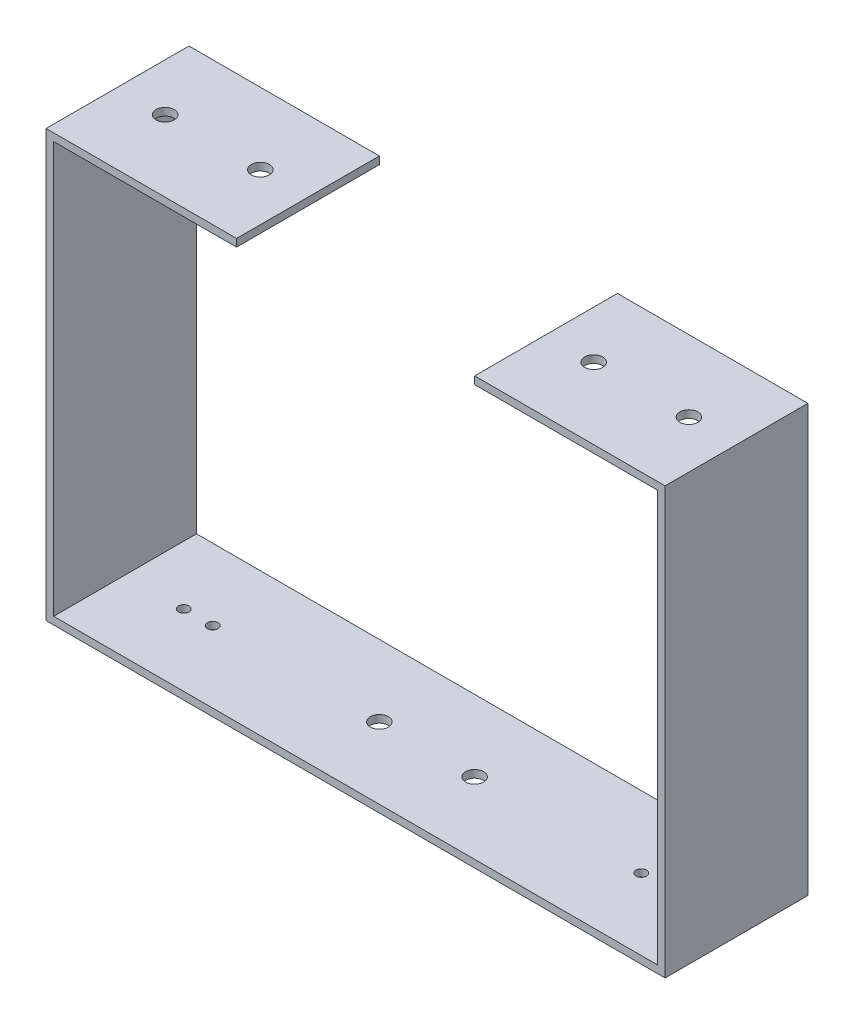
ISO-10303-21;
HEADER;
FILE_DESCRIPTION(('STEP AP214'),'2;1');
FILE_NAME('part.step','',(''),(''),'','','');
FILE_SCHEMA(('AUTOMOTIVE_DESIGN { 1 0 10303 214 1 1 1 1 }'));
ENDSEC;
DATA;
#1=APPLICATION_CONTEXT('core data for automotive mechanical design processes');
#2=APPLICATION_PROTOCOL_DEFINITION('international standard','automotive_design',2000,#1);
#3=PRODUCT_CONTEXT('',#1,'mechanical');
#4=PRODUCT('Part','Part','',(#3));
#5=PRODUCT_RELATED_PRODUCT_CATEGORY('part','',(#4));
#6=PRODUCT_DEFINITION_FORMATION('','',#4);
#7=PRODUCT_DEFINITION_CONTEXT('part definition',#1,'design');
#8=PRODUCT_DEFINITION('design','',#6,#7);
#9=PRODUCT_DEFINITION_SHAPE('','',#8);
#10=(LENGTH_UNIT() NAMED_UNIT(*) SI_UNIT(.MILLI.,.METRE.));
#11=(NAMED_UNIT(*) PLANE_ANGLE_UNIT() SI_UNIT($,.RADIAN.));
#12=(NAMED_UNIT(*) SI_UNIT($,.STERADIAN.) SOLID_ANGLE_UNIT());
#13=UNCERTAINTY_MEASURE_WITH_UNIT(LENGTH_MEASURE(1.E-05),#10,'distance_accuracy_value','');
#14=(GEOMETRIC_REPRESENTATION_CONTEXT(3) GLOBAL_UNCERTAINTY_ASSIGNED_CONTEXT((#13)) GLOBAL_UNIT_ASSIGNED_CONTEXT((#10,
#11,#12)) REPRESENTATION_CONTEXT('',''));
#15=CARTESIAN_POINT('',(0.,0.,0.));
#16=DIRECTION('',(0.,0.,1.));
#17=DIRECTION('',(1.,0.,0.));
#18=AXIS2_PLACEMENT_3D('',#15,#16,#17);
#19=CARTESIAN_POINT('',(0.,0.,-15.));
#20=DIRECTION('',(0.,-1.,0.));
#21=DIRECTION('',(1.,0.,0.));
#22=AXIS2_PLACEMENT_3D('',#19,#20,#21);
#23=PLANE('',#22);
#24=CARTESIAN_POINT('',(-10.,0.,0.));
#25=DIRECTION('',(0.,-1.,0.));
#26=DIRECTION('',(0.,0.,-1.));
#27=AXIS2_PLACEMENT_3D('',#24,#25,#26);
#28=CIRCLE('',#27,1.89864999999999);
#29=CARTESIAN_POINT('',(-10.,0.,-1.89864999999999));
#30=VERTEX_POINT('',#29);
#31=EDGE_CURVE('E386',#30,#30,#28,.T.);
#32=ORIENTED_EDGE('',*,*,#31,.F.);
#33=EDGE_LOOP('',(#32));
#34=FACE_BOUND('',#33,.T.);
#35=CARTESIAN_POINT('',(10.,0.,0.));
#36=DIRECTION('',(0.,-1.,0.));
#37=DIRECTION('',(0.,0.,-1.));
#38=AXIS2_PLACEMENT_3D('',#35,#36,#37);
#39=CIRCLE('',#38,1.89864999999999);
#40=CARTESIAN_POINT('',(10.,0.,-1.89864999999999));
#41=VERTEX_POINT('',#40);
#42=EDGE_CURVE('E388',#41,#41,#39,.T.);
#43=ORIENTED_EDGE('',*,*,#42,.F.);
#44=EDGE_LOOP('',(#43));
#45=FACE_BOUND('',#44,.T.);
#46=CARTESIAN_POINT('',(51.096,0.,0.));
#47=DIRECTION('',(0.,-1.,0.));
#48=DIRECTION('',(0.,0.,-1.));
#49=AXIS2_PLACEMENT_3D('',#46,#47,#48);
#50=CIRCLE('',#49,1.21919999999999);
#51=CARTESIAN_POINT('',(51.096,0.,-1.21919999999999));
#52=VERTEX_POINT('',#51);
#53=EDGE_CURVE('E408',#52,#52,#50,.T.);
#54=ORIENTED_EDGE('',*,*,#53,.F.);
#55=EDGE_LOOP('',(#54));
#56=FACE_BOUND('',#55,.T.);
#57=CARTESIAN_POINT('',(45.,0.,0.));
#58=DIRECTION('',(0.,-1.,0.));
#59=DIRECTION('',(0.,0.,-1.));
#60=AXIS2_PLACEMENT_3D('',#57,#58,#59);
#61=CIRCLE('',#60,1.21919999999999);
#62=CARTESIAN_POINT('',(45.,0.,-1.21919999999999));
#63=VERTEX_POINT('',#62);
#64=EDGE_CURVE('E413',#63,#63,#61,.T.);
#65=ORIENTED_EDGE('',*,*,#64,.F.);
#66=EDGE_LOOP('',(#65));
#67=FACE_BOUND('',#66,.T.);
#68=CARTESIAN_POINT('',(-51.096,0.,0.));
#69=DIRECTION('',(0.,-1.,0.));
#70=DIRECTION('',(0.,0.,-1.));
#71=AXIS2_PLACEMENT_3D('',#68,#69,#70);
#72=CIRCLE('',#71,1.21919999999999);
#73=CARTESIAN_POINT('',(-51.096,0.,-1.21919999999999));
#74=VERTEX_POINT('',#73);
#75=EDGE_CURVE('E194',#74,#74,#72,.T.);
#76=ORIENTED_EDGE('',*,*,#75,.F.);
#77=EDGE_LOOP('',(#76));
#78=FACE_BOUND('',#77,.T.);
#79=CARTESIAN_POINT('',(-45.,0.,0.));
#80=DIRECTION('',(0.,-1.,0.));
#81=DIRECTION('',(0.,0.,-1.));
#82=AXIS2_PLACEMENT_3D('',#79,#80,#81);
#83=CIRCLE('',#82,1.21919999999999);
#84=CARTESIAN_POINT('',(-45.,0.,-1.21919999999999));
#85=VERTEX_POINT('',#84);
#86=EDGE_CURVE('E201',#85,#85,#83,.T.);
#87=ORIENTED_EDGE('',*,*,#86,.F.);
#88=EDGE_LOOP('',(#87));
#89=FACE_BOUND('',#88,.T.);
#90=DIRECTION('',(1.,0.,0.));
#91=VECTOR('',#90,1.);
#92=CARTESIAN_POINT('',(0.,0.,-15.));
#93=LINE('',#92,#91);
#94=CARTESIAN_POINT('',(-65.,0.,-15.));
#95=VERTEX_POINT('',#94);
#96=CARTESIAN_POINT('',(65.,0.,-15.));
#97=VERTEX_POINT('',#96);
#98=EDGE_CURVE('E136',#95,#97,#93,.T.);
#99=ORIENTED_EDGE('',*,*,#98,.T.);
#100=DIRECTION('',(0.,0.,1.));
#101=VECTOR('',#100,1.);
#102=CARTESIAN_POINT('',(65.,0.,-15.));
#103=LINE('',#102,#101);
#104=CARTESIAN_POINT('',(65.,0.,15.));
#105=VERTEX_POINT('',#104);
#106=EDGE_CURVE('E134',#97,#105,#103,.T.);
#107=ORIENTED_EDGE('',*,*,#106,.T.);
#108=DIRECTION('',(1.,0.,0.));
#109=VECTOR('',#108,1.);
#110=CARTESIAN_POINT('',(0.,0.,15.));
#111=LINE('',#110,#109);
#112=CARTESIAN_POINT('',(-65.,0.,15.));
#113=VERTEX_POINT('',#112);
#114=EDGE_CURVE('E122',#113,#105,#111,.T.);
#115=ORIENTED_EDGE('',*,*,#114,.F.);
#116=DIRECTION('',(0.,0.,1.));
#117=VECTOR('',#116,1.);
#118=CARTESIAN_POINT('',(-65.,0.,-15.));
#119=LINE('',#118,#117);
#120=EDGE_CURVE('E11',#95,#113,#119,.T.);
#121=ORIENTED_EDGE('',*,*,#120,.F.);
#122=EDGE_LOOP('',(#99,#107,#115,#121));
#123=FACE_BOUND('',#122,.T.);
#124=ADVANCED_FACE('F34',(#34,#45,#56,#67,#78,#89,#123),#23,.T.);
#125=CARTESIAN_POINT('',(-65.,0.,-15.));
#126=DIRECTION('',(-1.,0.,0.));
#127=DIRECTION('',(0.,0.,1.));
#128=AXIS2_PLACEMENT_3D('',#125,#126,#127);
#129=PLANE('',#128);
#130=ORIENTED_EDGE('',*,*,#120,.T.);
#131=DIRECTION('',(0.,-1.,0.));
#132=VECTOR('',#131,1.);
#133=CARTESIAN_POINT('',(-65.,0.,15.));
#134=LINE('',#133,#132);
#135=CARTESIAN_POINT('',(-65.,89.52,15.));
#136=VERTEX_POINT('',#135);
#137=EDGE_CURVE('E130',#136,#113,#134,.T.);
#138=ORIENTED_EDGE('',*,*,#137,.F.);
#139=DIRECTION('',(0.,0.,1.));
#140=VECTOR('',#139,1.);
#141=CARTESIAN_POINT('',(-65.,89.52,-15.));
#142=LINE('',#141,#140);
#143=CARTESIAN_POINT('',(-65.,89.52,-15.));
#144=VERTEX_POINT('',#143);
#145=EDGE_CURVE('E43',#144,#136,#142,.T.);
#146=ORIENTED_EDGE('',*,*,#145,.F.);
#147=DIRECTION('',(0.,-1.,0.));
#148=VECTOR('',#147,1.);
#149=CARTESIAN_POINT('',(-65.,0.,-15.));
#150=LINE('',#149,#148);
#151=EDGE_CURVE('E237',#144,#95,#150,.T.);
#152=ORIENTED_EDGE('',*,*,#151,.T.);
#153=EDGE_LOOP('',(#130,#138,#146,#152));
#154=FACE_BOUND('',#153,.T.);
#155=ADVANCED_FACE('F284',(#154),#129,.T.);
#156=CARTESIAN_POINT('',(-65.,89.52,-15.));
#157=DIRECTION('',(0.,1.,0.));
#158=DIRECTION('',(0.,0.,1.));
#159=AXIS2_PLACEMENT_3D('',#156,#157,#158);
#160=PLANE('',#159);
#161=CARTESIAN_POINT('',(-35.,89.52,0.));
#162=DIRECTION('',(0.,1.,0.));
#163=DIRECTION('',(0.,0.,1.));
#164=AXIS2_PLACEMENT_3D('',#161,#162,#163);
#165=CIRCLE('',#164,1.89865);
#166=CARTESIAN_POINT('',(-35.,89.52,1.89865000000001));
#167=VERTEX_POINT('',#166);
#168=EDGE_CURVE('E175',#167,#167,#165,.T.);
#169=ORIENTED_EDGE('',*,*,#168,.F.);
#170=EDGE_LOOP('',(#169));
#171=FACE_BOUND('',#170,.T.);
#172=CARTESIAN_POINT('',(-55.,89.52,0.));
#173=DIRECTION('',(0.,1.,0.));
#174=DIRECTION('',(0.,0.,1.));
#175=AXIS2_PLACEMENT_3D('',#172,#173,#174);
#176=CIRCLE('',#175,1.89865);
#177=CARTESIAN_POINT('',(-55.,89.52,1.89865000000001));
#178=VERTEX_POINT('',#177);
#179=EDGE_CURVE('E188',#178,#178,#176,.T.);
#180=ORIENTED_EDGE('',*,*,#179,.F.);
#181=EDGE_LOOP('',(#180));
#182=FACE_BOUND('',#181,.T.);
#183=ORIENTED_EDGE('',*,*,#145,.T.);
#184=DIRECTION('',(-1.,0.,0.));
#185=VECTOR('',#184,1.);
#186=CARTESIAN_POINT('',(-65.,89.52,15.));
#187=LINE('',#186,#185);
#188=CARTESIAN_POINT('',(-25.,89.52,15.));
#189=VERTEX_POINT('',#188);
#190=EDGE_CURVE('E220',#189,#136,#187,.T.);
#191=ORIENTED_EDGE('',*,*,#190,.F.);
#192=DIRECTION('',(0.,0.,1.));
#193=VECTOR('',#192,1.);
#194=CARTESIAN_POINT('',(-25.,89.52,-15.));
#195=LINE('',#194,#193);
#196=CARTESIAN_POINT('',(-25.,89.52,-15.));
#197=VERTEX_POINT('',#196);
#198=EDGE_CURVE('E242',#197,#189,#195,.T.);
#199=ORIENTED_EDGE('',*,*,#198,.F.);
#200=DIRECTION('',(-1.,0.,0.));
#201=VECTOR('',#200,1.);
#202=CARTESIAN_POINT('',(-65.,89.52,-15.));
#203=LINE('',#202,#201);
#204=EDGE_CURVE('E234',#197,#144,#203,.T.);
#205=ORIENTED_EDGE('',*,*,#204,.T.);
#206=EDGE_LOOP('',(#183,#191,#199,#205));
#207=FACE_BOUND('',#206,.T.);
#208=ADVANCED_FACE('F282',(#171,#182,#207),#160,.T.);
#209=CARTESIAN_POINT('',(-25.,89.52,-15.));
#210=DIRECTION('',(1.,0.,0.));
#211=DIRECTION('',(0.,0.,-1.));
#212=AXIS2_PLACEMENT_3D('',#209,#210,#211);
#213=PLANE('',#212);
#214=ORIENTED_EDGE('',*,*,#198,.T.);
#215=DIRECTION('',(0.,1.,0.));
#216=VECTOR('',#215,1.);
#217=CARTESIAN_POINT('',(-25.,89.52,15.));
#218=LINE('',#217,#216);
#219=CARTESIAN_POINT('',(-25.,87.9325,15.));
#220=VERTEX_POINT('',#219);
#221=EDGE_CURVE('E217',#220,#189,#218,.T.);
#222=ORIENTED_EDGE('',*,*,#221,.F.);
#223=DIRECTION('',(0.,0.,1.));
#224=VECTOR('',#223,1.);
#225=CARTESIAN_POINT('',(-25.,87.9325,-15.));
#226=LINE('',#225,#224);
#227=CARTESIAN_POINT('',(-25.,87.9325,-15.));
#228=VERTEX_POINT('',#227);
#229=EDGE_CURVE('E244',#228,#220,#226,.T.);
#230=ORIENTED_EDGE('',*,*,#229,.F.);
#231=DIRECTION('',(0.,1.,0.));
#232=VECTOR('',#231,1.);
#233=CARTESIAN_POINT('',(-25.,89.52,-15.));
#234=LINE('',#233,#232);
#235=EDGE_CURVE('E231',#228,#197,#234,.T.);
#236=ORIENTED_EDGE('',*,*,#235,.T.);
#237=EDGE_LOOP('',(#214,#222,#230,#236));
#238=FACE_BOUND('',#237,.T.);
#239=ADVANCED_FACE('F278',(#238),#213,.T.);
#240=CARTESIAN_POINT('',(-63.4125,87.9325,-15.));
#241=DIRECTION('',(0.,-1.,0.));
#242=DIRECTION('',(0.,0.,-1.));
#243=AXIS2_PLACEMENT_3D('',#240,#241,#242);
#244=PLANE('',#243);
#245=CARTESIAN_POINT('',(-35.,87.9325,0.));
#246=DIRECTION('',(0.,-1.,0.));
#247=DIRECTION('',(0.,0.,-1.));
#248=AXIS2_PLACEMENT_3D('',#245,#246,#247);
#249=CIRCLE('',#248,1.89865);
#250=CARTESIAN_POINT('',(-35.,87.9325,-1.89865));
#251=VERTEX_POINT('',#250);
#252=EDGE_CURVE('E185',#251,#251,#249,.F.);
#253=ORIENTED_EDGE('',*,*,#252,.T.);
#254=EDGE_LOOP('',(#253));
#255=FACE_BOUND('',#254,.T.);
#256=CARTESIAN_POINT('',(-55.,87.9325,0.));
#257=DIRECTION('',(0.,-1.,0.));
#258=DIRECTION('',(0.,0.,-1.));
#259=AXIS2_PLACEMENT_3D('',#256,#257,#258);
#260=CIRCLE('',#259,1.89865);
#261=CARTESIAN_POINT('',(-55.,87.9325,-1.89864999999999));
#262=VERTEX_POINT('',#261);
#263=EDGE_CURVE('E191',#262,#262,#260,.F.);
#264=ORIENTED_EDGE('',*,*,#263,.T.);
#265=EDGE_LOOP('',(#264));
#266=FACE_BOUND('',#265,.T.);
#267=ORIENTED_EDGE('',*,*,#229,.T.);
#268=DIRECTION('',(1.,0.,0.));
#269=VECTOR('',#268,1.);
#270=CARTESIAN_POINT('',(-63.4125,87.9325,15.));
#271=LINE('',#270,#269);
#272=CARTESIAN_POINT('',(-63.4125,87.9325,15.));
#273=VERTEX_POINT('',#272);
#274=EDGE_CURVE('E214',#273,#220,#271,.T.);
#275=ORIENTED_EDGE('',*,*,#274,.F.);
#276=DIRECTION('',(0.,0.,1.));
#277=VECTOR('',#276,1.);
#278=CARTESIAN_POINT('',(-63.4125,87.9325,-15.));
#279=LINE('',#278,#277);
#280=CARTESIAN_POINT('',(-63.4125,87.9325,-15.));
#281=VERTEX_POINT('',#280);
#282=EDGE_CURVE('E246',#281,#273,#279,.T.);
#283=ORIENTED_EDGE('',*,*,#282,.F.);
#284=DIRECTION('',(1.,0.,0.));
#285=VECTOR('',#284,1.);
#286=CARTESIAN_POINT('',(-63.4125,87.9325,-15.));
#287=LINE('',#286,#285);
#288=EDGE_CURVE('E228',#281,#228,#287,.T.);
#289=ORIENTED_EDGE('',*,*,#288,.T.);
#290=EDGE_LOOP('',(#267,#275,#283,#289));
#291=FACE_BOUND('',#290,.T.);
#292=ADVANCED_FACE('F273',(#255,#266,#291),#244,.T.);
#293=CARTESIAN_POINT('',(-63.4125,1.58749999999999,-15.));
#294=DIRECTION('',(1.,0.,0.));
#295=DIRECTION('',(0.,0.,-1.));
#296=AXIS2_PLACEMENT_3D('',#293,#294,#295);
#297=PLANE('',#296);
#298=ORIENTED_EDGE('',*,*,#282,.T.);
#299=DIRECTION('',(0.,1.,0.));
#300=VECTOR('',#299,1.);
#301=CARTESIAN_POINT('',(-63.4125,1.58749999999999,15.));
#302=LINE('',#301,#300);
#303=CARTESIAN_POINT('',(-63.4125,1.58749999999999,15.));
#304=VERTEX_POINT('',#303);
#305=EDGE_CURVE('E211',#304,#273,#302,.T.);
#306=ORIENTED_EDGE('',*,*,#305,.F.);
#307=DIRECTION('',(0.,0.,1.));
#308=VECTOR('',#307,1.);
#309=CARTESIAN_POINT('',(-63.4125,1.58749999999999,-15.));
#310=LINE('',#309,#308);
#311=CARTESIAN_POINT('',(-63.4125,1.58749999999999,-15.));
#312=VERTEX_POINT('',#311);
#313=EDGE_CURVE('E239',#312,#304,#310,.T.);
#314=ORIENTED_EDGE('',*,*,#313,.F.);
#315=DIRECTION('',(0.,1.,0.));
#316=VECTOR('',#315,1.);
#317=CARTESIAN_POINT('',(-63.4125,1.58749999999999,-15.));
#318=LINE('',#317,#316);
#319=EDGE_CURVE('E225',#312,#281,#318,.T.);
#320=ORIENTED_EDGE('',*,*,#319,.T.);
#321=EDGE_LOOP('',(#298,#306,#314,#320));
#322=FACE_BOUND('',#321,.T.);
#323=ADVANCED_FACE('F260',(#322),#297,.T.);
#324=CARTESIAN_POINT('',(0.,1.5875,-15.));
#325=DIRECTION('',(0.,1.,0.));
#326=DIRECTION('',(-1.,0.,0.));
#327=AXIS2_PLACEMENT_3D('',#324,#325,#326);
#328=PLANE('',#327);
#329=CARTESIAN_POINT('',(-10.,1.5875,0.));
#330=DIRECTION('',(0.,1.,0.));
#331=DIRECTION('',(-1.,0.,0.));
#332=AXIS2_PLACEMENT_3D('',#329,#330,#331);
#333=CIRCLE('',#332,1.89864999999999);
#334=CARTESIAN_POINT('',(-11.89865,1.5875,0.));
#335=VERTEX_POINT('',#334);
#336=EDGE_CURVE('E384',#335,#335,#333,.T.);
#337=ORIENTED_EDGE('',*,*,#336,.F.);
#338=EDGE_LOOP('',(#337));
#339=FACE_BOUND('',#338,.T.);
#340=CARTESIAN_POINT('',(10.,1.5875,0.));
#341=DIRECTION('',(0.,1.,0.));
#342=DIRECTION('',(-1.,0.,0.));
#343=AXIS2_PLACEMENT_3D('',#340,#341,#342);
#344=CIRCLE('',#343,1.89864999999999);
#345=CARTESIAN_POINT('',(8.10135000000001,1.5875,0.));
#346=VERTEX_POINT('',#345);
#347=EDGE_CURVE('E393',#346,#346,#344,.T.);
#348=ORIENTED_EDGE('',*,*,#347,.F.);
#349=EDGE_LOOP('',(#348));
#350=FACE_BOUND('',#349,.T.);
#351=CARTESIAN_POINT('',(51.096,1.58750000000001,0.));
#352=DIRECTION('',(0.,1.,0.));
#353=DIRECTION('',(-1.,0.,0.));
#354=AXIS2_PLACEMENT_3D('',#351,#352,#353);
#355=CIRCLE('',#354,1.10686113494132);
#356=CARTESIAN_POINT('',(49.9891388650587,1.58750000000001,0.));
#357=VERTEX_POINT('',#356);
#358=EDGE_CURVE('E38',#357,#357,#355,.T.);
#359=ORIENTED_EDGE('',*,*,#358,.F.);
#360=EDGE_LOOP('',(#359));
#361=FACE_BOUND('',#360,.T.);
#362=CARTESIAN_POINT('',(45.,1.58750000000001,0.));
#363=DIRECTION('',(0.,1.,0.));
#364=DIRECTION('',(-1.,0.,0.));
#365=AXIS2_PLACEMENT_3D('',#362,#363,#364);
#366=CIRCLE('',#365,1.10686113494132);
#367=CARTESIAN_POINT('',(43.8931388650587,1.58750000000001,0.));
#368=VERTEX_POINT('',#367);
#369=EDGE_CURVE('E146',#368,#368,#366,.T.);
#370=ORIENTED_EDGE('',*,*,#369,.F.);
#371=EDGE_LOOP('',(#370));
#372=FACE_BOUND('',#371,.T.);
#373=CARTESIAN_POINT('',(-51.096,1.58749999999999,0.));
#374=DIRECTION('',(0.,1.,0.));
#375=DIRECTION('',(-1.,0.,0.));
#376=AXIS2_PLACEMENT_3D('',#373,#374,#375);
#377=CIRCLE('',#376,1.10686113494134);
#378=CARTESIAN_POINT('',(-52.2028611349413,1.58749999999999,0.));
#379=VERTEX_POINT('',#378);
#380=EDGE_CURVE('E200',#379,#379,#377,.T.);
#381=ORIENTED_EDGE('',*,*,#380,.F.);
#382=EDGE_LOOP('',(#381));
#383=FACE_BOUND('',#382,.T.);
#384=CARTESIAN_POINT('',(-45.,1.58749999999999,0.));
#385=DIRECTION('',(0.,1.,0.));
#386=DIRECTION('',(-1.,0.,0.));
#387=AXIS2_PLACEMENT_3D('',#384,#385,#386);
#388=CIRCLE('',#387,1.10686113494134);
#389=CARTESIAN_POINT('',(-46.1068611349413,1.58749999999999,0.));
#390=VERTEX_POINT('',#389);
#391=EDGE_CURVE('E207',#390,#390,#388,.T.);
#392=ORIENTED_EDGE('',*,*,#391,.F.);
#393=EDGE_LOOP('',(#392));
#394=FACE_BOUND('',#393,.T.);
#395=ORIENTED_EDGE('',*,*,#313,.T.);
#396=DIRECTION('',(-1.,0.,0.));
#397=VECTOR('',#396,1.);
#398=CARTESIAN_POINT('',(0.,1.5875,15.));
#399=LINE('',#398,#397);
#400=CARTESIAN_POINT('',(63.4125,1.58749999999999,15.));
#401=VERTEX_POINT('',#400);
#402=EDGE_CURVE('E208',#401,#304,#399,.T.);
#403=ORIENTED_EDGE('',*,*,#402,.F.);
#404=DIRECTION('',(0.,0.,1.));
#405=VECTOR('',#404,1.);
#406=CARTESIAN_POINT('',(63.4125,1.58749999999999,-15.));
#407=LINE('',#406,#405);
#408=CARTESIAN_POINT('',(63.4125,1.58749999999999,-15.));
#409=VERTEX_POINT('',#408);
#410=EDGE_CURVE('E172',#409,#401,#407,.T.);
#411=ORIENTED_EDGE('',*,*,#410,.F.);
#412=DIRECTION('',(-1.,0.,0.));
#413=VECTOR('',#412,1.);
#414=CARTESIAN_POINT('',(0.,1.5875,-15.));
#415=LINE('',#414,#413);
#416=EDGE_CURVE('E131',#409,#312,#415,.T.);
#417=ORIENTED_EDGE('',*,*,#416,.T.);
#418=EDGE_LOOP('',(#395,#403,#411,#417));
#419=FACE_BOUND('',#418,.T.);
#420=ADVANCED_FACE('F36',(#339,#350,#361,#372,#383,#394,#419),#328,.T.);
#421=CARTESIAN_POINT('',(0.,0.,-15.));
#422=DIRECTION('',(0.,0.,-1.));
#423=DIRECTION('',(-1.,0.,0.));
#424=AXIS2_PLACEMENT_3D('',#421,#422,#423);
#425=PLANE('',#424);
#426=ORIENTED_EDGE('',*,*,#416,.F.);
#427=DIRECTION('',(0.,1.,0.));
#428=VECTOR('',#427,1.);
#429=CARTESIAN_POINT('',(63.4125,1.58749999999999,-15.));
#430=LINE('',#429,#428);
#431=CARTESIAN_POINT('',(63.4125,87.9325,-15.));
#432=VERTEX_POINT('',#431);
#433=EDGE_CURVE('E141',#409,#432,#430,.T.);
#434=ORIENTED_EDGE('',*,*,#433,.T.);
#435=DIRECTION('',(-1.,0.,0.));
#436=VECTOR('',#435,1.);
#437=CARTESIAN_POINT('',(63.4125,87.9325,-15.));
#438=LINE('',#437,#436);
#439=CARTESIAN_POINT('',(25.,87.9325,-15.));
#440=VERTEX_POINT('',#439);
#441=EDGE_CURVE('E169',#432,#440,#438,.T.);
#442=ORIENTED_EDGE('',*,*,#441,.T.);
#443=DIRECTION('',(0.,1.,0.));
#444=VECTOR('',#443,1.);
#445=CARTESIAN_POINT('',(25.,89.52,-15.));
#446=LINE('',#445,#444);
#447=CARTESIAN_POINT('',(25.,89.52,-15.));
#448=VERTEX_POINT('',#447);
#449=EDGE_CURVE('E167',#440,#448,#446,.T.);
#450=ORIENTED_EDGE('',*,*,#449,.T.);
#451=DIRECTION('',(1.,0.,0.));
#452=VECTOR('',#451,1.);
#453=CARTESIAN_POINT('',(65.,89.52,-15.));
#454=LINE('',#453,#452);
#455=CARTESIAN_POINT('',(65.,89.52,-15.));
#456=VERTEX_POINT('',#455);
#457=EDGE_CURVE('E165',#448,#456,#454,.T.);
#458=ORIENTED_EDGE('',*,*,#457,.T.);
#459=DIRECTION('',(0.,-1.,0.));
#460=VECTOR('',#459,1.);
#461=CARTESIAN_POINT('',(65.,0.,-15.));
#462=LINE('',#461,#460);
#463=EDGE_CURVE('E163',#456,#97,#462,.T.);
#464=ORIENTED_EDGE('',*,*,#463,.T.);
#465=ORIENTED_EDGE('',*,*,#98,.F.);
#466=ORIENTED_EDGE('',*,*,#151,.F.);
#467=ORIENTED_EDGE('',*,*,#204,.F.);
#468=ORIENTED_EDGE('',*,*,#235,.F.);
#469=ORIENTED_EDGE('',*,*,#288,.F.);
#470=ORIENTED_EDGE('',*,*,#319,.F.);
#471=EDGE_LOOP('',(#426,#434,#442,#450,#458,#464,#465,#466,#467,#468,#469,#470));
#472=FACE_BOUND('',#471,.T.);
#473=ADVANCED_FACE('F259',(#472),#425,.T.);
#474=CARTESIAN_POINT('',(0.,0.,15.));
#475=DIRECTION('',(0.,0.,-1.));
#476=DIRECTION('',(-1.,0.,0.));
#477=AXIS2_PLACEMENT_3D('',#474,#475,#476);
#478=PLANE('',#477);
#479=ORIENTED_EDGE('',*,*,#114,.T.);
#480=DIRECTION('',(0.,-1.,0.));
#481=VECTOR('',#480,1.);
#482=CARTESIAN_POINT('',(65.,0.,15.));
#483=LINE('',#482,#481);
#484=CARTESIAN_POINT('',(65.,89.52,15.));
#485=VERTEX_POINT('',#484);
#486=EDGE_CURVE('E127',#485,#105,#483,.T.);
#487=ORIENTED_EDGE('',*,*,#486,.F.);
#488=DIRECTION('',(1.,0.,0.));
#489=VECTOR('',#488,1.);
#490=CARTESIAN_POINT('',(65.,89.52,15.));
#491=LINE('',#490,#489);
#492=CARTESIAN_POINT('',(25.,89.52,15.));
#493=VERTEX_POINT('',#492);
#494=EDGE_CURVE('E145',#493,#485,#491,.T.);
#495=ORIENTED_EDGE('',*,*,#494,.F.);
#496=DIRECTION('',(0.,1.,0.));
#497=VECTOR('',#496,1.);
#498=CARTESIAN_POINT('',(25.,89.52,15.));
#499=LINE('',#498,#497);
#500=CARTESIAN_POINT('',(25.,87.9325,15.));
#501=VERTEX_POINT('',#500);
#502=EDGE_CURVE('E148',#501,#493,#499,.T.);
#503=ORIENTED_EDGE('',*,*,#502,.F.);
#504=DIRECTION('',(-1.,0.,0.));
#505=VECTOR('',#504,1.);
#506=CARTESIAN_POINT('',(63.4125,87.9325,15.));
#507=LINE('',#506,#505);
#508=CARTESIAN_POINT('',(63.4125,87.9325,15.));
#509=VERTEX_POINT('',#508);
#510=EDGE_CURVE('E157',#509,#501,#507,.T.);
#511=ORIENTED_EDGE('',*,*,#510,.F.);
#512=DIRECTION('',(0.,1.,0.));
#513=VECTOR('',#512,1.);
#514=CARTESIAN_POINT('',(63.4125,1.58749999999999,15.));
#515=LINE('',#514,#513);
#516=EDGE_CURVE('E160',#401,#509,#515,.T.);
#517=ORIENTED_EDGE('',*,*,#516,.F.);
#518=ORIENTED_EDGE('',*,*,#402,.T.);
#519=ORIENTED_EDGE('',*,*,#305,.T.);
#520=ORIENTED_EDGE('',*,*,#274,.T.);
#521=ORIENTED_EDGE('',*,*,#221,.T.);
#522=ORIENTED_EDGE('',*,*,#190,.T.);
#523=ORIENTED_EDGE('',*,*,#137,.T.);
#524=EDGE_LOOP('',(#479,#487,#495,#503,#511,#517,#518,#519,#520,#521,#522,#523));
#525=FACE_BOUND('',#524,.T.);
#526=ADVANCED_FACE('F124',(#525),#478,.F.);
#527=CARTESIAN_POINT('',(-45.,1.51999999999999,0.));
#528=DIRECTION('',(0.,-1.,0.));
#529=DIRECTION('',(0.,0.,-1.));
#530=AXIS2_PLACEMENT_3D('',#527,#528,#529);
#531=CONICAL_SURFACE('',#530,1.2192,1.02974425867665);
#532=ORIENTED_EDGE('',*,*,#391,.T.);
#533=EDGE_LOOP('',(#532));
#534=FACE_BOUND('',#533,.T.);
#535=CARTESIAN_POINT('',(-45.,1.51999999999999,0.));
#536=DIRECTION('',(0.,-1.,0.));
#537=DIRECTION('',(0.,0.,-1.));
#538=AXIS2_PLACEMENT_3D('',#535,#536,#537);
#539=CIRCLE('',#538,1.2192);
#540=CARTESIAN_POINT('',(-45.,1.51999999999999,-1.2192));
#541=VERTEX_POINT('',#540);
#542=EDGE_CURVE('E204',#541,#541,#539,.T.);
#543=ORIENTED_EDGE('',*,*,#542,.T.);
#544=EDGE_LOOP('',(#543));
#545=FACE_BOUND('',#544,.T.);
#546=ADVANCED_FACE('F308',(#534,#545),#531,.F.);
#547=CARTESIAN_POINT('',(-45.,0.,0.));
#548=DIRECTION('',(0.,-1.,0.));
#549=DIRECTION('',(0.,0.,-1.));
#550=AXIS2_PLACEMENT_3D('',#547,#548,#549);
#551=CYLINDRICAL_SURFACE('',#550,1.21919999999999);
#552=ORIENTED_EDGE('',*,*,#542,.F.);
#553=EDGE_LOOP('',(#552));
#554=FACE_BOUND('',#553,.T.);
#555=ORIENTED_EDGE('',*,*,#86,.T.);
#556=EDGE_LOOP('',(#555));
#557=FACE_BOUND('',#556,.T.);
#558=ADVANCED_FACE('F311',(#554,#557),#551,.F.);
#559=CARTESIAN_POINT('',(-51.096,1.51999999999999,0.));
#560=DIRECTION('',(0.,-1.,0.));
#561=DIRECTION('',(0.,0.,-1.));
#562=AXIS2_PLACEMENT_3D('',#559,#560,#561);
#563=CONICAL_SURFACE('',#562,1.2192,1.02974425867665);
#564=ORIENTED_EDGE('',*,*,#380,.T.);
#565=EDGE_LOOP('',(#564));
#566=FACE_BOUND('',#565,.T.);
#567=CARTESIAN_POINT('',(-51.096,1.51999999999999,0.));
#568=DIRECTION('',(0.,-1.,0.));
#569=DIRECTION('',(0.,0.,-1.));
#570=AXIS2_PLACEMENT_3D('',#567,#568,#569);
#571=CIRCLE('',#570,1.2192);
#572=CARTESIAN_POINT('',(-51.096,1.51999999999999,-1.2192));
#573=VERTEX_POINT('',#572);
#574=EDGE_CURVE('E197',#573,#573,#571,.T.);
#575=ORIENTED_EDGE('',*,*,#574,.T.);
#576=EDGE_LOOP('',(#575));
#577=FACE_BOUND('',#576,.T.);
#578=ADVANCED_FACE('F254',(#566,#577),#563,.F.);
#579=CARTESIAN_POINT('',(-51.096,0.,0.));
#580=DIRECTION('',(0.,-1.,0.));
#581=DIRECTION('',(0.,0.,-1.));
#582=AXIS2_PLACEMENT_3D('',#579,#580,#581);
#583=CYLINDRICAL_SURFACE('',#582,1.21919999999999);
#584=ORIENTED_EDGE('',*,*,#574,.F.);
#585=EDGE_LOOP('',(#584));
#586=FACE_BOUND('',#585,.T.);
#587=ORIENTED_EDGE('',*,*,#75,.T.);
#588=EDGE_LOOP('',(#587));
#589=FACE_BOUND('',#588,.T.);
#590=ADVANCED_FACE('F318',(#586,#589),#583,.F.);
#591=CARTESIAN_POINT('',(-55.,89.52,0.));
#592=DIRECTION('',(0.,1.,0.));
#593=DIRECTION('',(0.,0.,1.));
#594=AXIS2_PLACEMENT_3D('',#591,#592,#593);
#595=CYLINDRICAL_SURFACE('',#594,1.89865);
#596=ORIENTED_EDGE('',*,*,#263,.F.);
#597=EDGE_LOOP('',(#596));
#598=FACE_BOUND('',#597,.T.);
#599=ORIENTED_EDGE('',*,*,#179,.T.);
#600=EDGE_LOOP('',(#599));
#601=FACE_BOUND('',#600,.T.);
#602=ADVANCED_FACE('F321',(#598,#601),#595,.F.);
#603=CARTESIAN_POINT('',(-35.,89.52,0.));
#604=DIRECTION('',(0.,1.,0.));
#605=DIRECTION('',(0.,0.,1.));
#606=AXIS2_PLACEMENT_3D('',#603,#604,#605);
#607=CYLINDRICAL_SURFACE('',#606,1.89865);
#608=ORIENTED_EDGE('',*,*,#252,.F.);
#609=EDGE_LOOP('',(#608));
#610=FACE_BOUND('',#609,.T.);
#611=ORIENTED_EDGE('',*,*,#168,.T.);
#612=EDGE_LOOP('',(#611));
#613=FACE_BOUND('',#612,.T.);
#614=ADVANCED_FACE('F325',(#610,#613),#607,.F.);
#615=CARTESIAN_POINT('',(63.4125,1.58749999999999,-15.));
#616=DIRECTION('',(1.,0.,0.));
#617=DIRECTION('',(0.,0.,-1.));
#618=AXIS2_PLACEMENT_3D('',#615,#616,#617);
#619=PLANE('',#618);
#620=ORIENTED_EDGE('',*,*,#410,.T.);
#621=ORIENTED_EDGE('',*,*,#516,.T.);
#622=DIRECTION('',(0.,0.,1.));
#623=VECTOR('',#622,1.);
#624=CARTESIAN_POINT('',(63.4125,87.9325,-15.));
#625=LINE('',#624,#623);
#626=EDGE_CURVE('E176',#432,#509,#625,.T.);
#627=ORIENTED_EDGE('',*,*,#626,.F.);
#628=ORIENTED_EDGE('',*,*,#433,.F.);
#629=EDGE_LOOP('',(#620,#621,#627,#628));
#630=FACE_BOUND('',#629,.T.);
#631=ADVANCED_FACE('F329',(#630),#619,.F.);
#632=CARTESIAN_POINT('',(63.4125,87.9325,-15.));
#633=DIRECTION('',(0.,1.,0.));
#634=DIRECTION('',(0.,0.,1.));
#635=AXIS2_PLACEMENT_3D('',#632,#633,#634);
#636=PLANE('',#635);
#637=CARTESIAN_POINT('',(35.,87.9325,0.));
#638=DIRECTION('',(0.,1.,0.));
#639=DIRECTION('',(0.,0.,1.));
#640=AXIS2_PLACEMENT_3D('',#637,#638,#639);
#641=CIRCLE('',#640,1.89865);
#642=CARTESIAN_POINT('',(35.,87.9325,1.89865000000001));
#643=VERTEX_POINT('',#642);
#644=EDGE_CURVE('E399',#643,#643,#641,.T.);
#645=ORIENTED_EDGE('',*,*,#644,.T.);
#646=EDGE_LOOP('',(#645));
#647=FACE_BOUND('',#646,.T.);
#648=CARTESIAN_POINT('',(55.,87.9325,0.));
#649=DIRECTION('',(0.,1.,0.));
#650=DIRECTION('',(0.,0.,1.));
#651=AXIS2_PLACEMENT_3D('',#648,#649,#650);
#652=CIRCLE('',#651,1.89865);
#653=CARTESIAN_POINT('',(55.,87.9325,1.89865000000001));
#654=VERTEX_POINT('',#653);
#655=EDGE_CURVE('E405',#654,#654,#652,.T.);
#656=ORIENTED_EDGE('',*,*,#655,.T.);
#657=EDGE_LOOP('',(#656));
#658=FACE_BOUND('',#657,.T.);
#659=ORIENTED_EDGE('',*,*,#626,.T.);
#660=ORIENTED_EDGE('',*,*,#510,.T.);
#661=DIRECTION('',(0.,0.,1.));
#662=VECTOR('',#661,1.);
#663=CARTESIAN_POINT('',(25.,87.9325,-15.));
#664=LINE('',#663,#662);
#665=EDGE_CURVE('E178',#440,#501,#664,.T.);
#666=ORIENTED_EDGE('',*,*,#665,.F.);
#667=ORIENTED_EDGE('',*,*,#441,.F.);
#668=EDGE_LOOP('',(#659,#660,#666,#667));
#669=FACE_BOUND('',#668,.T.);
#670=ADVANCED_FACE('F341',(#647,#658,#669),#636,.F.);
#671=CARTESIAN_POINT('',(25.,89.52,-15.));
#672=DIRECTION('',(1.,0.,0.));
#673=DIRECTION('',(0.,0.,-1.));
#674=AXIS2_PLACEMENT_3D('',#671,#672,#673);
#675=PLANE('',#674);
#676=ORIENTED_EDGE('',*,*,#665,.T.);
#677=ORIENTED_EDGE('',*,*,#502,.T.);
#678=DIRECTION('',(0.,0.,1.));
#679=VECTOR('',#678,1.);
#680=CARTESIAN_POINT('',(25.,89.52,-15.));
#681=LINE('',#680,#679);
#682=EDGE_CURVE('E180',#448,#493,#681,.T.);
#683=ORIENTED_EDGE('',*,*,#682,.F.);
#684=ORIENTED_EDGE('',*,*,#449,.F.);
#685=EDGE_LOOP('',(#676,#677,#683,#684));
#686=FACE_BOUND('',#685,.T.);
#687=ADVANCED_FACE('F337',(#686),#675,.F.);
#688=CARTESIAN_POINT('',(65.,89.52,-15.));
#689=DIRECTION('',(0.,-1.,0.));
#690=DIRECTION('',(0.,0.,-1.));
#691=AXIS2_PLACEMENT_3D('',#688,#689,#690);
#692=PLANE('',#691);
#693=CARTESIAN_POINT('',(35.,89.52,0.));
#694=DIRECTION('',(0.,1.,0.));
#695=DIRECTION('',(0.,0.,1.));
#696=AXIS2_PLACEMENT_3D('',#693,#694,#695);
#697=CIRCLE('',#696,1.89865);
#698=CARTESIAN_POINT('',(35.,89.52,1.89865000000001));
#699=VERTEX_POINT('',#698);
#700=EDGE_CURVE('E396',#699,#699,#697,.T.);
#701=ORIENTED_EDGE('',*,*,#700,.F.);
#702=EDGE_LOOP('',(#701));
#703=FACE_BOUND('',#702,.T.);
#704=CARTESIAN_POINT('',(55.,89.52,0.));
#705=DIRECTION('',(0.,1.,0.));
#706=DIRECTION('',(0.,0.,1.));
#707=AXIS2_PLACEMENT_3D('',#704,#705,#706);
#708=CIRCLE('',#707,1.89865);
#709=CARTESIAN_POINT('',(55.,89.52,1.89865000000001));
#710=VERTEX_POINT('',#709);
#711=EDGE_CURVE('E402',#710,#710,#708,.T.);
#712=ORIENTED_EDGE('',*,*,#711,.F.);
#713=EDGE_LOOP('',(#712));
#714=FACE_BOUND('',#713,.T.);
#715=ORIENTED_EDGE('',*,*,#682,.T.);
#716=ORIENTED_EDGE('',*,*,#494,.T.);
#717=DIRECTION('',(0.,0.,1.));
#718=VECTOR('',#717,1.);
#719=CARTESIAN_POINT('',(65.,89.52,-15.));
#720=LINE('',#719,#718);
#721=EDGE_CURVE('E140',#456,#485,#720,.T.);
#722=ORIENTED_EDGE('',*,*,#721,.F.);
#723=ORIENTED_EDGE('',*,*,#457,.F.);
#724=EDGE_LOOP('',(#715,#716,#722,#723));
#725=FACE_BOUND('',#724,.T.);
#726=ADVANCED_FACE('F334',(#703,#714,#725),#692,.F.);
#727=CARTESIAN_POINT('',(65.,0.,-15.));
#728=DIRECTION('',(-1.,0.,0.));
#729=DIRECTION('',(0.,0.,1.));
#730=AXIS2_PLACEMENT_3D('',#727,#728,#729);
#731=PLANE('',#730);
#732=ORIENTED_EDGE('',*,*,#721,.T.);
#733=ORIENTED_EDGE('',*,*,#486,.T.);
#734=ORIENTED_EDGE('',*,*,#106,.F.);
#735=ORIENTED_EDGE('',*,*,#463,.F.);
#736=EDGE_LOOP('',(#732,#733,#734,#735));
#737=FACE_BOUND('',#736,.T.);
#738=ADVANCED_FACE('F143',(#737),#731,.F.);
#739=CARTESIAN_POINT('',(45.,1.51999999999999,0.));
#740=DIRECTION('',(0.,-1.,0.));
#741=DIRECTION('',(0.,0.,-1.));
#742=AXIS2_PLACEMENT_3D('',#739,#740,#741);
#743=CONICAL_SURFACE('',#742,1.2192,1.02974425867665);
#744=ORIENTED_EDGE('',*,*,#369,.T.);
#745=EDGE_LOOP('',(#744));
#746=FACE_BOUND('',#745,.T.);
#747=CARTESIAN_POINT('',(45.,1.51999999999999,0.));
#748=DIRECTION('',(0.,-1.,0.));
#749=DIRECTION('',(0.,0.,-1.));
#750=AXIS2_PLACEMENT_3D('',#747,#748,#749);
#751=CIRCLE('',#750,1.2192);
#752=CARTESIAN_POINT('',(45.,1.51999999999999,-1.2192));
#753=VERTEX_POINT('',#752);
#754=EDGE_CURVE('E151',#753,#753,#751,.T.);
#755=ORIENTED_EDGE('',*,*,#754,.T.);
#756=EDGE_LOOP('',(#755));
#757=FACE_BOUND('',#756,.T.);
#758=ADVANCED_FACE('F333',(#746,#757),#743,.F.);
#759=CARTESIAN_POINT('',(45.,0.,0.));
#760=DIRECTION('',(0.,-1.,0.));
#761=DIRECTION('',(0.,0.,-1.));
#762=AXIS2_PLACEMENT_3D('',#759,#760,#761);
#763=CYLINDRICAL_SURFACE('',#762,1.21919999999999);
#764=ORIENTED_EDGE('',*,*,#754,.F.);
#765=EDGE_LOOP('',(#764));
#766=FACE_BOUND('',#765,.T.);
#767=ORIENTED_EDGE('',*,*,#64,.T.);
#768=EDGE_LOOP('',(#767));
#769=FACE_BOUND('',#768,.T.);
#770=ADVANCED_FACE('F351',(#766,#769),#763,.F.);
#771=CARTESIAN_POINT('',(51.096,1.51999999999999,0.));
#772=DIRECTION('',(0.,-1.,0.));
#773=DIRECTION('',(0.,0.,-1.));
#774=AXIS2_PLACEMENT_3D('',#771,#772,#773);
#775=CONICAL_SURFACE('',#774,1.2192,1.02974425867665);
#776=ORIENTED_EDGE('',*,*,#358,.T.);
#777=EDGE_LOOP('',(#776));
#778=FACE_BOUND('',#777,.T.);
#779=CARTESIAN_POINT('',(51.096,1.51999999999999,0.));
#780=DIRECTION('',(0.,-1.,0.));
#781=DIRECTION('',(0.,0.,-1.));
#782=AXIS2_PLACEMENT_3D('',#779,#780,#781);
#783=CIRCLE('',#782,1.2192);
#784=CARTESIAN_POINT('',(51.096,1.51999999999999,-1.2192));
#785=VERTEX_POINT('',#784);
#786=EDGE_CURVE('E411',#785,#785,#783,.T.);
#787=ORIENTED_EDGE('',*,*,#786,.T.);
#788=EDGE_LOOP('',(#787));
#789=FACE_BOUND('',#788,.T.);
#790=ADVANCED_FACE('F355',(#778,#789),#775,.F.);
#791=CARTESIAN_POINT('',(51.096,0.,0.));
#792=DIRECTION('',(0.,-1.,0.));
#793=DIRECTION('',(0.,0.,-1.));
#794=AXIS2_PLACEMENT_3D('',#791,#792,#793);
#795=CYLINDRICAL_SURFACE('',#794,1.21919999999999);
#796=ORIENTED_EDGE('',*,*,#786,.F.);
#797=EDGE_LOOP('',(#796));
#798=FACE_BOUND('',#797,.T.);
#799=ORIENTED_EDGE('',*,*,#53,.T.);
#800=EDGE_LOOP('',(#799));
#801=FACE_BOUND('',#800,.T.);
#802=ADVANCED_FACE('F359',(#798,#801),#795,.F.);
#803=CARTESIAN_POINT('',(55.,89.52,0.));
#804=DIRECTION('',(0.,1.,0.));
#805=DIRECTION('',(0.,0.,1.));
#806=AXIS2_PLACEMENT_3D('',#803,#804,#805);
#807=CYLINDRICAL_SURFACE('',#806,1.89865);
#808=ORIENTED_EDGE('',*,*,#655,.F.);
#809=EDGE_LOOP('',(#808));
#810=FACE_BOUND('',#809,.T.);
#811=ORIENTED_EDGE('',*,*,#711,.T.);
#812=EDGE_LOOP('',(#811));
#813=FACE_BOUND('',#812,.T.);
#814=ADVANCED_FACE('F363',(#810,#813),#807,.F.);
#815=CARTESIAN_POINT('',(35.,89.52,0.));
#816=DIRECTION('',(0.,1.,0.));
#817=DIRECTION('',(0.,0.,1.));
#818=AXIS2_PLACEMENT_3D('',#815,#816,#817);
#819=CYLINDRICAL_SURFACE('',#818,1.89865);
#820=ORIENTED_EDGE('',*,*,#644,.F.);
#821=EDGE_LOOP('',(#820));
#822=FACE_BOUND('',#821,.T.);
#823=ORIENTED_EDGE('',*,*,#700,.T.);
#824=EDGE_LOOP('',(#823));
#825=FACE_BOUND('',#824,.T.);
#826=ADVANCED_FACE('F367',(#822,#825),#819,.F.);
#827=CARTESIAN_POINT('',(10.,0.,0.));
#828=DIRECTION('',(0.,-1.,0.));
#829=DIRECTION('',(0.,0.,-1.));
#830=AXIS2_PLACEMENT_3D('',#827,#828,#829);
#831=CYLINDRICAL_SURFACE('',#830,1.89864999999999);
#832=ORIENTED_EDGE('',*,*,#347,.T.);
#833=EDGE_LOOP('',(#832));
#834=FACE_BOUND('',#833,.T.);
#835=ORIENTED_EDGE('',*,*,#42,.T.);
#836=EDGE_LOOP('',(#835));
#837=FACE_BOUND('',#836,.T.);
#838=ADVANCED_FACE('F371',(#834,#837),#831,.F.);
#839=CARTESIAN_POINT('',(-10.,0.,0.));
#840=DIRECTION('',(0.,-1.,0.));
#841=DIRECTION('',(0.,0.,-1.));
#842=AXIS2_PLACEMENT_3D('',#839,#840,#841);
#843=CYLINDRICAL_SURFACE('',#842,1.89864999999999);
#844=ORIENTED_EDGE('',*,*,#336,.T.);
#845=EDGE_LOOP('',(#844));
#846=FACE_BOUND('',#845,.T.);
#847=ORIENTED_EDGE('',*,*,#31,.T.);
#848=EDGE_LOOP('',(#847));
#849=FACE_BOUND('',#848,.T.);
#850=ADVANCED_FACE('F375',(#846,#849),#843,.F.);
#851=CLOSED_SHELL('',(#124,#155,#208,#239,#292,#323,#420,#473,#526,#546,#558,#578,#590,#602,
#614,#631,#670,#687,#726,#738,#758,#770,#790,#802,#814,#826,#838,#850));
#852=MANIFOLD_SOLID_BREP('B2',#851);
#853=ADVANCED_BREP_SHAPE_REPRESENTATION('',(#18,#852),#14);
#854=SHAPE_DEFINITION_REPRESENTATION(#9,#853);
ENDSEC;
END-ISO-10303-21;
